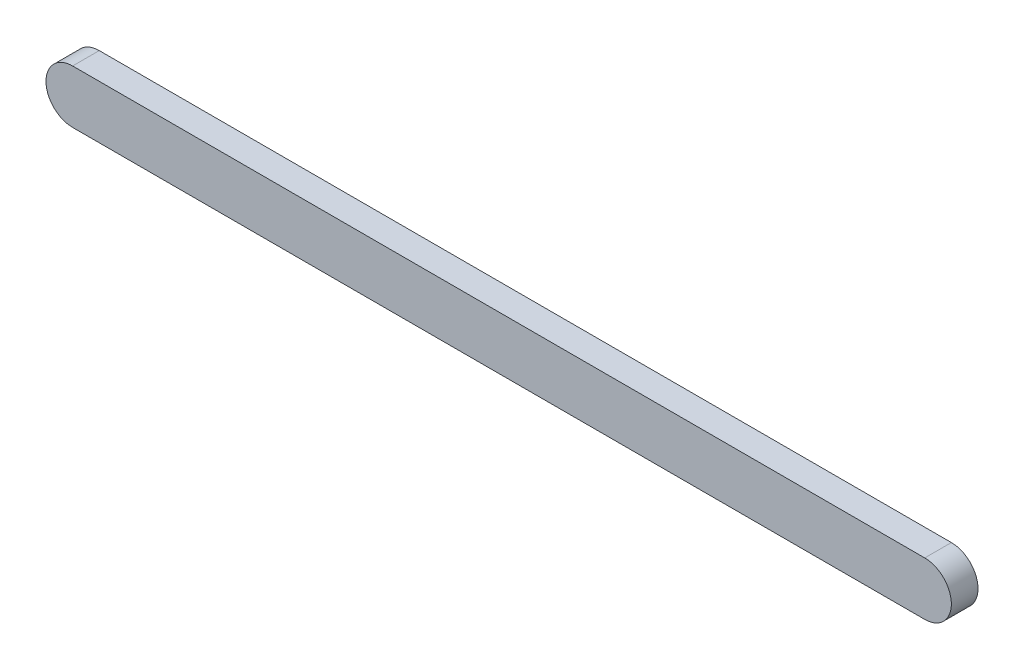
ISO-10303-21;
HEADER;
FILE_DESCRIPTION(('STEP AP214'),'2;1');
FILE_NAME('part.step','',(''),(''),'','','');
FILE_SCHEMA(('AUTOMOTIVE_DESIGN { 1 0 10303 214 1 1 1 1 }'));
ENDSEC;
DATA;
#1=APPLICATION_CONTEXT('core data for automotive mechanical design processes');
#2=APPLICATION_PROTOCOL_DEFINITION('international standard','automotive_design',2000,#1);
#3=PRODUCT_CONTEXT('',#1,'mechanical');
#4=PRODUCT('Part','Part','',(#3));
#5=PRODUCT_RELATED_PRODUCT_CATEGORY('part','',(#4));
#6=PRODUCT_DEFINITION_FORMATION('','',#4);
#7=PRODUCT_DEFINITION_CONTEXT('part definition',#1,'design');
#8=PRODUCT_DEFINITION('design','',#6,#7);
#9=PRODUCT_DEFINITION_SHAPE('','',#8);
#10=(LENGTH_UNIT() NAMED_UNIT(*) SI_UNIT(.MILLI.,.METRE.));
#11=(NAMED_UNIT(*) PLANE_ANGLE_UNIT() SI_UNIT($,.RADIAN.));
#12=(NAMED_UNIT(*) SI_UNIT($,.STERADIAN.) SOLID_ANGLE_UNIT());
#13=UNCERTAINTY_MEASURE_WITH_UNIT(LENGTH_MEASURE(1.E-05),#10,'distance_accuracy_value','');
#14=(GEOMETRIC_REPRESENTATION_CONTEXT(3) GLOBAL_UNCERTAINTY_ASSIGNED_CONTEXT((#13)) GLOBAL_UNIT_ASSIGNED_CONTEXT((#10,
#11,#12)) REPRESENTATION_CONTEXT('',''));
#15=CARTESIAN_POINT('',(0.,0.,0.));
#16=DIRECTION('',(0.,0.,1.));
#17=DIRECTION('',(1.,0.,0.));
#18=AXIS2_PLACEMENT_3D('',#15,#16,#17);
#19=CARTESIAN_POINT('',(0.,0.,2.5));
#20=DIRECTION('',(0.,0.,-1.));
#21=DIRECTION('',(-1.,0.,0.));
#22=AXIS2_PLACEMENT_3D('',#19,#20,#21);
#23=CYLINDRICAL_SURFACE('',#22,2.5);
#24=CARTESIAN_POINT('',(0.,0.,0.));
#25=DIRECTION('',(0.,0.,1.));
#26=DIRECTION('',(1.,0.,0.));
#27=AXIS2_PLACEMENT_3D('',#24,#25,#26);
#28=CIRCLE('',#27,2.5);
#29=CARTESIAN_POINT('',(0.,2.5,0.));
#30=VERTEX_POINT('',#29);
#31=CARTESIAN_POINT('',(0.,-2.5,0.));
#32=VERTEX_POINT('',#31);
#33=EDGE_CURVE('E103',#30,#32,#28,.T.);
#34=ORIENTED_EDGE('',*,*,#33,.T.);
#35=DIRECTION('',(0.,0.,-1.));
#36=VECTOR('',#35,1.);
#37=CARTESIAN_POINT('',(0.,-2.5,2.5));
#38=LINE('',#37,#36);
#39=CARTESIAN_POINT('',(0.,-2.5,2.5));
#40=VERTEX_POINT('',#39);
#41=EDGE_CURVE('E11',#40,#32,#38,.T.);
#42=ORIENTED_EDGE('',*,*,#41,.F.);
#43=CARTESIAN_POINT('',(0.,0.,2.5));
#44=DIRECTION('',(0.,0.,1.));
#45=DIRECTION('',(1.,0.,0.));
#46=AXIS2_PLACEMENT_3D('',#43,#44,#45);
#47=CIRCLE('',#46,2.5);
#48=CARTESIAN_POINT('',(0.,2.5,2.5));
#49=VERTEX_POINT('',#48);
#50=EDGE_CURVE('E91',#49,#40,#47,.T.);
#51=ORIENTED_EDGE('',*,*,#50,.F.);
#52=DIRECTION('',(0.,0.,-1.));
#53=VECTOR('',#52,1.);
#54=CARTESIAN_POINT('',(0.,2.5,2.5));
#55=LINE('',#54,#53);
#56=EDGE_CURVE('E99',#49,#30,#55,.T.);
#57=ORIENTED_EDGE('',*,*,#56,.T.);
#58=EDGE_LOOP('',(#34,#42,#51,#57));
#59=FACE_BOUND('',#58,.T.);
#60=ADVANCED_FACE('F40',(#59),#23,.T.);
#61=CARTESIAN_POINT('',(0.,-2.5,2.5));
#62=DIRECTION('',(0.,1.,0.));
#63=DIRECTION('',(0.,0.,1.));
#64=AXIS2_PLACEMENT_3D('',#61,#62,#63);
#65=PLANE('',#64);
#66=DIRECTION('',(1.,0.,0.));
#67=VECTOR('',#66,1.);
#68=CARTESIAN_POINT('',(0.,-2.5,0.));
#69=LINE('',#68,#67);
#70=CARTESIAN_POINT('',(80.,-2.5,0.));
#71=VERTEX_POINT('',#70);
#72=EDGE_CURVE('E95',#32,#71,#69,.T.);
#73=ORIENTED_EDGE('',*,*,#72,.T.);
#74=DIRECTION('',(0.,0.,-1.));
#75=VECTOR('',#74,1.);
#76=CARTESIAN_POINT('',(80.,-2.5,2.5));
#77=LINE('',#76,#75);
#78=CARTESIAN_POINT('',(80.,-2.5,2.5));
#79=VERTEX_POINT('',#78);
#80=EDGE_CURVE('E48',#79,#71,#77,.T.);
#81=ORIENTED_EDGE('',*,*,#80,.F.);
#82=DIRECTION('',(1.,0.,0.));
#83=VECTOR('',#82,1.);
#84=CARTESIAN_POINT('',(0.,-2.5,2.5));
#85=LINE('',#84,#83);
#86=EDGE_CURVE('E86',#40,#79,#85,.T.);
#87=ORIENTED_EDGE('',*,*,#86,.F.);
#88=ORIENTED_EDGE('',*,*,#41,.T.);
#89=EDGE_LOOP('',(#73,#81,#87,#88));
#90=FACE_BOUND('',#89,.T.);
#91=ADVANCED_FACE('F94',(#90),#65,.F.);
#92=CARTESIAN_POINT('',(80.,0.,2.5));
#93=DIRECTION('',(0.,0.,-1.));
#94=DIRECTION('',(-1.,0.,0.));
#95=AXIS2_PLACEMENT_3D('',#92,#93,#94);
#96=CYLINDRICAL_SURFACE('',#95,2.5);
#97=CARTESIAN_POINT('',(80.,0.,0.));
#98=DIRECTION('',(0.,0.,1.));
#99=DIRECTION('',(1.,0.,0.));
#100=AXIS2_PLACEMENT_3D('',#97,#98,#99);
#101=CIRCLE('',#100,2.5);
#102=CARTESIAN_POINT('',(80.,2.5,0.));
#103=VERTEX_POINT('',#102);
#104=EDGE_CURVE('E73',#71,#103,#101,.T.);
#105=ORIENTED_EDGE('',*,*,#104,.T.);
#106=DIRECTION('',(0.,0.,-1.));
#107=VECTOR('',#106,1.);
#108=CARTESIAN_POINT('',(80.,2.5,2.5));
#109=LINE('',#108,#107);
#110=CARTESIAN_POINT('',(80.,2.5,2.5));
#111=VERTEX_POINT('',#110);
#112=EDGE_CURVE('E96',#111,#103,#109,.T.);
#113=ORIENTED_EDGE('',*,*,#112,.F.);
#114=CARTESIAN_POINT('',(80.,0.,2.5));
#115=DIRECTION('',(0.,0.,1.));
#116=DIRECTION('',(1.,0.,0.));
#117=AXIS2_PLACEMENT_3D('',#114,#115,#116);
#118=CIRCLE('',#117,2.5);
#119=EDGE_CURVE('E89',#79,#111,#118,.T.);
#120=ORIENTED_EDGE('',*,*,#119,.F.);
#121=ORIENTED_EDGE('',*,*,#80,.T.);
#122=EDGE_LOOP('',(#105,#113,#120,#121));
#123=FACE_BOUND('',#122,.T.);
#124=ADVANCED_FACE('F97',(#123),#96,.T.);
#125=CARTESIAN_POINT('',(0.,2.5,2.5));
#126=DIRECTION('',(0.,-1.,0.));
#127=DIRECTION('',(0.,0.,-1.));
#128=AXIS2_PLACEMENT_3D('',#125,#126,#127);
#129=PLANE('',#128);
#130=DIRECTION('',(-1.,0.,0.));
#131=VECTOR('',#130,1.);
#132=CARTESIAN_POINT('',(0.,2.5,0.));
#133=LINE('',#132,#131);
#134=EDGE_CURVE('E79',#103,#30,#133,.T.);
#135=ORIENTED_EDGE('',*,*,#134,.T.);
#136=ORIENTED_EDGE('',*,*,#56,.F.);
#137=DIRECTION('',(-1.,0.,0.));
#138=VECTOR('',#137,1.);
#139=CARTESIAN_POINT('',(0.,2.5,2.5));
#140=LINE('',#139,#138);
#141=EDGE_CURVE('E56',#111,#49,#140,.T.);
#142=ORIENTED_EDGE('',*,*,#141,.F.);
#143=ORIENTED_EDGE('',*,*,#112,.T.);
#144=EDGE_LOOP('',(#135,#136,#142,#143));
#145=FACE_BOUND('',#144,.T.);
#146=ADVANCED_FACE('F110',(#145),#129,.F.);
#147=CARTESIAN_POINT('',(0.,0.,2.5));
#148=DIRECTION('',(0.,0.,1.));
#149=DIRECTION('',(1.,0.,0.));
#150=AXIS2_PLACEMENT_3D('',#147,#148,#149);
#151=PLANE('',#150);
#152=ORIENTED_EDGE('',*,*,#50,.T.);
#153=ORIENTED_EDGE('',*,*,#86,.T.);
#154=ORIENTED_EDGE('',*,*,#119,.T.);
#155=ORIENTED_EDGE('',*,*,#141,.T.);
#156=EDGE_LOOP('',(#152,#153,#154,#155));
#157=FACE_BOUND('',#156,.T.);
#158=ADVANCED_FACE('F87',(#157),#151,.T.);
#159=CARTESIAN_POINT('',(0.,0.,0.));
#160=DIRECTION('',(0.,0.,1.));
#161=DIRECTION('',(1.,0.,0.));
#162=AXIS2_PLACEMENT_3D('',#159,#160,#161);
#163=PLANE('',#162);
#164=ORIENTED_EDGE('',*,*,#33,.F.);
#165=ORIENTED_EDGE('',*,*,#134,.F.);
#166=ORIENTED_EDGE('',*,*,#104,.F.);
#167=ORIENTED_EDGE('',*,*,#72,.F.);
#168=EDGE_LOOP('',(#164,#165,#166,#167));
#169=FACE_BOUND('',#168,.T.);
#170=ADVANCED_FACE('F113',(#169),#163,.F.);
#171=CLOSED_SHELL('',(#60,#91,#124,#146,#158,#170));
#172=MANIFOLD_SOLID_BREP('B2',#171);
#173=ADVANCED_BREP_SHAPE_REPRESENTATION('',(#18,#172),#14);
#174=SHAPE_DEFINITION_REPRESENTATION(#9,#173);
ENDSEC;
END-ISO-10303-21;
